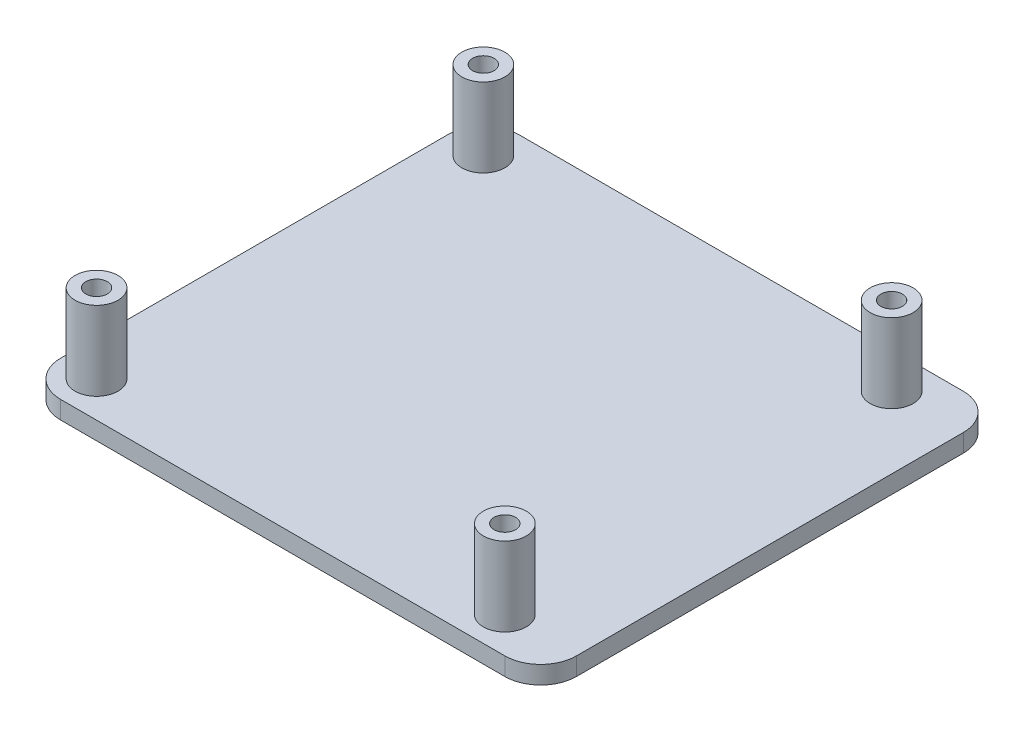
ISO-10303-21;
HEADER;
FILE_DESCRIPTION(('STEP AP214'),'2;1');
FILE_NAME('part.step','',(''),(''),'','','');
FILE_SCHEMA(('AUTOMOTIVE_DESIGN { 1 0 10303 214 1 1 1 1 }'));
ENDSEC;
DATA;
#1=APPLICATION_CONTEXT('core data for automotive mechanical design processes');
#2=APPLICATION_PROTOCOL_DEFINITION('international standard','automotive_design',2000,#1);
#3=PRODUCT_CONTEXT('',#1,'mechanical');
#4=PRODUCT('Part','Part','',(#3));
#5=PRODUCT_RELATED_PRODUCT_CATEGORY('part','',(#4));
#6=PRODUCT_DEFINITION_FORMATION('','',#4);
#7=PRODUCT_DEFINITION_CONTEXT('part definition',#1,'design');
#8=PRODUCT_DEFINITION('design','',#6,#7);
#9=PRODUCT_DEFINITION_SHAPE('','',#8);
#10=(LENGTH_UNIT() NAMED_UNIT(*) SI_UNIT(.MILLI.,.METRE.));
#11=(NAMED_UNIT(*) PLANE_ANGLE_UNIT() SI_UNIT($,.RADIAN.));
#12=(NAMED_UNIT(*) SI_UNIT($,.STERADIAN.) SOLID_ANGLE_UNIT());
#13=UNCERTAINTY_MEASURE_WITH_UNIT(LENGTH_MEASURE(1.E-05),#10,'distance_accuracy_value','');
#14=(GEOMETRIC_REPRESENTATION_CONTEXT(3) GLOBAL_UNCERTAINTY_ASSIGNED_CONTEXT((#13)) GLOBAL_UNIT_ASSIGNED_CONTEXT((#10,
#11,#12)) REPRESENTATION_CONTEXT('',''));
#15=CARTESIAN_POINT('',(0.,0.,0.));
#16=DIRECTION('',(0.,0.,1.));
#17=DIRECTION('',(1.,0.,0.));
#18=AXIS2_PLACEMENT_3D('',#15,#16,#17);
#19=CARTESIAN_POINT('',(-36.,2.5,-32.));
#20=DIRECTION('',(1.,0.,0.));
#21=DIRECTION('',(0.,0.,-1.));
#22=AXIS2_PLACEMENT_3D('',#19,#20,#21);
#23=PLANE('',#22);
#24=DIRECTION('',(0.,0.,1.));
#25=VECTOR('',#24,1.);
#26=CARTESIAN_POINT('',(-36.,0.,-32.));
#27=LINE('',#26,#25);
#28=CARTESIAN_POINT('',(-36.,0.,-27.));
#29=VERTEX_POINT('',#28);
#30=CARTESIAN_POINT('',(-36.,0.,27.));
#31=VERTEX_POINT('',#30);
#32=EDGE_CURVE('E136',#29,#31,#27,.T.);
#33=ORIENTED_EDGE('',*,*,#32,.T.);
#34=DIRECTION('',(0.,-1.,0.));
#35=VECTOR('',#34,1.);
#36=CARTESIAN_POINT('',(-36.,2.5,27.));
#37=LINE('',#36,#35);
#38=CARTESIAN_POINT('',(-36.,2.5,27.));
#39=VERTEX_POINT('',#38);
#40=EDGE_CURVE('E111',#31,#39,#37,.F.);
#41=ORIENTED_EDGE('',*,*,#40,.T.);
#42=DIRECTION('',(0.,0.,1.));
#43=VECTOR('',#42,1.);
#44=CARTESIAN_POINT('',(-36.,2.5,-32.));
#45=LINE('',#44,#43);
#46=CARTESIAN_POINT('',(-36.,2.5,-27.));
#47=VERTEX_POINT('',#46);
#48=EDGE_CURVE('E149',#47,#39,#45,.T.);
#49=ORIENTED_EDGE('',*,*,#48,.F.);
#50=DIRECTION('',(0.,-1.,0.));
#51=VECTOR('',#50,1.);
#52=CARTESIAN_POINT('',(-36.,2.5,-27.));
#53=LINE('',#52,#51);
#54=EDGE_CURVE('E117',#47,#29,#53,.T.);
#55=ORIENTED_EDGE('',*,*,#54,.T.);
#56=EDGE_LOOP('',(#33,#41,#49,#55));
#57=FACE_BOUND('',#56,.T.);
#58=ADVANCED_FACE('F39',(#57),#23,.F.);
#59=CARTESIAN_POINT('',(-36.,2.5,32.));
#60=DIRECTION('',(0.,0.,-1.));
#61=DIRECTION('',(-1.,0.,0.));
#62=AXIS2_PLACEMENT_3D('',#59,#60,#61);
#63=PLANE('',#62);
#64=DIRECTION('',(1.,0.,0.));
#65=VECTOR('',#64,1.);
#66=CARTESIAN_POINT('',(-36.,2.5,32.));
#67=LINE('',#66,#65);
#68=CARTESIAN_POINT('',(-31.,2.5,32.));
#69=VERTEX_POINT('',#68);
#70=CARTESIAN_POINT('',(31.,2.5,32.));
#71=VERTEX_POINT('',#70);
#72=EDGE_CURVE('E127',#69,#71,#67,.T.);
#73=ORIENTED_EDGE('',*,*,#72,.F.);
#74=DIRECTION('',(0.,-1.,0.));
#75=VECTOR('',#74,1.);
#76=CARTESIAN_POINT('',(-31.,2.5,32.));
#77=LINE('',#76,#75);
#78=CARTESIAN_POINT('',(-31.,0.,32.));
#79=VERTEX_POINT('',#78);
#80=EDGE_CURVE('E110',#69,#79,#77,.T.);
#81=ORIENTED_EDGE('',*,*,#80,.T.);
#82=DIRECTION('',(1.,0.,0.));
#83=VECTOR('',#82,1.);
#84=CARTESIAN_POINT('',(-36.,0.,32.));
#85=LINE('',#84,#83);
#86=CARTESIAN_POINT('',(31.,0.,32.));
#87=VERTEX_POINT('',#86);
#88=EDGE_CURVE('E124',#79,#87,#85,.T.);
#89=ORIENTED_EDGE('',*,*,#88,.T.);
#90=DIRECTION('',(0.,-1.,0.));
#91=VECTOR('',#90,1.);
#92=CARTESIAN_POINT('',(31.,2.5,32.));
#93=LINE('',#92,#91);
#94=EDGE_CURVE('E130',#87,#71,#93,.F.);
#95=ORIENTED_EDGE('',*,*,#94,.T.);
#96=EDGE_LOOP('',(#73,#81,#89,#95));
#97=FACE_BOUND('',#96,.T.);
#98=ADVANCED_FACE('F123',(#97),#63,.F.);
#99=CARTESIAN_POINT('',(36.,2.5,-32.));
#100=DIRECTION('',(-1.,0.,0.));
#101=DIRECTION('',(0.,0.,1.));
#102=AXIS2_PLACEMENT_3D('',#99,#100,#101);
#103=PLANE('',#102);
#104=DIRECTION('',(0.,0.,-1.));
#105=VECTOR('',#104,1.);
#106=CARTESIAN_POINT('',(36.,2.5,-32.));
#107=LINE('',#106,#105);
#108=CARTESIAN_POINT('',(36.,2.5,27.));
#109=VERTEX_POINT('',#108);
#110=CARTESIAN_POINT('',(36.,2.5,-27.));
#111=VERTEX_POINT('',#110);
#112=EDGE_CURVE('E203',#109,#111,#107,.T.);
#113=ORIENTED_EDGE('',*,*,#112,.F.);
#114=DIRECTION('',(0.,-1.,0.));
#115=VECTOR('',#114,1.);
#116=CARTESIAN_POINT('',(36.,2.5,27.));
#117=LINE('',#116,#115);
#118=CARTESIAN_POINT('',(36.,0.,27.));
#119=VERTEX_POINT('',#118);
#120=EDGE_CURVE('E197',#109,#119,#117,.T.);
#121=ORIENTED_EDGE('',*,*,#120,.T.);
#122=DIRECTION('',(0.,0.,-1.));
#123=VECTOR('',#122,1.);
#124=CARTESIAN_POINT('',(36.,0.,-32.));
#125=LINE('',#124,#123);
#126=CARTESIAN_POINT('',(36.,0.,-27.));
#127=VERTEX_POINT('',#126);
#128=EDGE_CURVE('E135',#119,#127,#125,.T.);
#129=ORIENTED_EDGE('',*,*,#128,.T.);
#130=DIRECTION('',(0.,-1.,0.));
#131=VECTOR('',#130,1.);
#132=CARTESIAN_POINT('',(36.,2.5,-27.));
#133=LINE('',#132,#131);
#134=EDGE_CURVE('E194',#127,#111,#133,.F.);
#135=ORIENTED_EDGE('',*,*,#134,.T.);
#136=EDGE_LOOP('',(#113,#121,#129,#135));
#137=FACE_BOUND('',#136,.T.);
#138=ADVANCED_FACE('F282',(#137),#103,.F.);
#139=CARTESIAN_POINT('',(-36.,2.5,-32.));
#140=DIRECTION('',(0.,0.,1.));
#141=DIRECTION('',(1.,0.,0.));
#142=AXIS2_PLACEMENT_3D('',#139,#140,#141);
#143=PLANE('',#142);
#144=DIRECTION('',(-1.,0.,0.));
#145=VECTOR('',#144,1.);
#146=CARTESIAN_POINT('',(-36.,2.5,-32.));
#147=LINE('',#146,#145);
#148=CARTESIAN_POINT('',(31.,2.5,-32.));
#149=VERTEX_POINT('',#148);
#150=CARTESIAN_POINT('',(-31.,2.5,-32.));
#151=VERTEX_POINT('',#150);
#152=EDGE_CURVE('E169',#149,#151,#147,.T.);
#153=ORIENTED_EDGE('',*,*,#152,.F.);
#154=DIRECTION('',(0.,-1.,0.));
#155=VECTOR('',#154,1.);
#156=CARTESIAN_POINT('',(31.,2.5,-32.));
#157=LINE('',#156,#155);
#158=CARTESIAN_POINT('',(31.,0.,-32.));
#159=VERTEX_POINT('',#158);
#160=EDGE_CURVE('E11',#149,#159,#157,.T.);
#161=ORIENTED_EDGE('',*,*,#160,.T.);
#162=DIRECTION('',(-1.,0.,0.));
#163=VECTOR('',#162,1.);
#164=CARTESIAN_POINT('',(-36.,0.,-32.));
#165=LINE('',#164,#163);
#166=CARTESIAN_POINT('',(-31.,0.,-32.));
#167=VERTEX_POINT('',#166);
#168=EDGE_CURVE('E141',#159,#167,#165,.T.);
#169=ORIENTED_EDGE('',*,*,#168,.T.);
#170=DIRECTION('',(0.,-1.,0.));
#171=VECTOR('',#170,1.);
#172=CARTESIAN_POINT('',(-31.,2.5,-32.));
#173=LINE('',#172,#171);
#174=EDGE_CURVE('E48',#167,#151,#173,.F.);
#175=ORIENTED_EDGE('',*,*,#174,.T.);
#176=EDGE_LOOP('',(#153,#161,#169,#175));
#177=FACE_BOUND('',#176,.T.);
#178=ADVANCED_FACE('F302',(#177),#143,.F.);
#179=CARTESIAN_POINT('',(0.,2.5,0.));
#180=DIRECTION('',(0.,1.,0.));
#181=DIRECTION('',(0.,0.,1.));
#182=AXIS2_PLACEMENT_3D('',#179,#180,#181);
#183=PLANE('',#182);
#184=CARTESIAN_POINT('',(26.,2.5,27.));
#185=DIRECTION('',(0.,1.,0.));
#186=DIRECTION('',(0.,0.,1.));
#187=AXIS2_PLACEMENT_3D('',#184,#185,#186);
#188=CIRCLE('',#187,3.);
#189=CARTESIAN_POINT('',(26.,2.5,30.));
#190=VERTEX_POINT('',#189);
#191=EDGE_CURVE('E167',#190,#190,#188,.T.);
#192=ORIENTED_EDGE('',*,*,#191,.F.);
#193=EDGE_LOOP('',(#192));
#194=FACE_BOUND('',#193,.T.);
#195=CARTESIAN_POINT('',(-31.,2.5,27.));
#196=DIRECTION('',(0.,1.,0.));
#197=DIRECTION('',(0.,0.,1.));
#198=AXIS2_PLACEMENT_3D('',#195,#196,#197);
#199=CIRCLE('',#198,3.);
#200=CARTESIAN_POINT('',(-31.,2.5,30.));
#201=VERTEX_POINT('',#200);
#202=EDGE_CURVE('E228',#201,#201,#199,.T.);
#203=ORIENTED_EDGE('',*,*,#202,.F.);
#204=EDGE_LOOP('',(#203));
#205=FACE_BOUND('',#204,.T.);
#206=CARTESIAN_POINT('',(26.,2.5,-27.));
#207=DIRECTION('',(0.,1.,0.));
#208=DIRECTION('',(0.,0.,1.));
#209=AXIS2_PLACEMENT_3D('',#206,#207,#208);
#210=CIRCLE('',#209,3.);
#211=CARTESIAN_POINT('',(26.,2.5,-24.));
#212=VERTEX_POINT('',#211);
#213=EDGE_CURVE('E220',#212,#212,#210,.T.);
#214=ORIENTED_EDGE('',*,*,#213,.F.);
#215=EDGE_LOOP('',(#214));
#216=FACE_BOUND('',#215,.T.);
#217=CARTESIAN_POINT('',(-31.,2.5,-27.));
#218=DIRECTION('',(0.,1.,0.));
#219=DIRECTION('',(0.,0.,1.));
#220=AXIS2_PLACEMENT_3D('',#217,#218,#219);
#221=CIRCLE('',#220,3.);
#222=CARTESIAN_POINT('',(-31.,2.5,-24.));
#223=VERTEX_POINT('',#222);
#224=EDGE_CURVE('E212',#223,#223,#221,.T.);
#225=ORIENTED_EDGE('',*,*,#224,.F.);
#226=EDGE_LOOP('',(#225));
#227=FACE_BOUND('',#226,.T.);
#228=ORIENTED_EDGE('',*,*,#48,.T.);
#229=CARTESIAN_POINT('',(-31.,2.5,27.));
#230=DIRECTION('',(0.,1.,0.));
#231=DIRECTION('',(0.,0.,1.));
#232=AXIS2_PLACEMENT_3D('',#229,#230,#231);
#233=CIRCLE('',#232,5.);
#234=EDGE_CURVE('E191',#39,#69,#233,.T.);
#235=ORIENTED_EDGE('',*,*,#234,.T.);
#236=ORIENTED_EDGE('',*,*,#72,.T.);
#237=CARTESIAN_POINT('',(31.,2.5,27.));
#238=DIRECTION('',(0.,1.,0.));
#239=DIRECTION('',(0.,0.,1.));
#240=AXIS2_PLACEMENT_3D('',#237,#238,#239);
#241=CIRCLE('',#240,5.);
#242=EDGE_CURVE('E188',#71,#109,#241,.T.);
#243=ORIENTED_EDGE('',*,*,#242,.T.);
#244=ORIENTED_EDGE('',*,*,#112,.T.);
#245=CARTESIAN_POINT('',(31.,2.5,-27.));
#246=DIRECTION('',(0.,1.,0.));
#247=DIRECTION('',(0.,0.,1.));
#248=AXIS2_PLACEMENT_3D('',#245,#246,#247);
#249=CIRCLE('',#248,5.);
#250=EDGE_CURVE('E61',#111,#149,#249,.T.);
#251=ORIENTED_EDGE('',*,*,#250,.T.);
#252=ORIENTED_EDGE('',*,*,#152,.T.);
#253=CARTESIAN_POINT('',(-31.,2.5,-27.));
#254=DIRECTION('',(0.,1.,0.));
#255=DIRECTION('',(0.,0.,1.));
#256=AXIS2_PLACEMENT_3D('',#253,#254,#255);
#257=CIRCLE('',#256,5.);
#258=EDGE_CURVE('E183',#151,#47,#257,.T.);
#259=ORIENTED_EDGE('',*,*,#258,.T.);
#260=EDGE_LOOP('',(#228,#235,#236,#243,#244,#251,#252,#259));
#261=FACE_BOUND('',#260,.T.);
#262=ADVANCED_FACE('F305',(#194,#205,#216,#227,#261),#183,.T.);
#263=CARTESIAN_POINT('',(0.,0.,0.));
#264=DIRECTION('',(0.,1.,0.));
#265=DIRECTION('',(0.,0.,1.));
#266=AXIS2_PLACEMENT_3D('',#263,#264,#265);
#267=PLANE('',#266);
#268=CARTESIAN_POINT('',(-31.,0.,27.));
#269=DIRECTION('',(0.,1.,0.));
#270=DIRECTION('',(0.,0.,1.));
#271=AXIS2_PLACEMENT_3D('',#268,#269,#270);
#272=CIRCLE('',#271,1.5);
#273=CARTESIAN_POINT('',(-31.,0.,28.5));
#274=VERTEX_POINT('',#273);
#275=EDGE_CURVE('E245',#274,#274,#272,.T.);
#276=ORIENTED_EDGE('',*,*,#275,.T.);
#277=EDGE_LOOP('',(#276));
#278=FACE_BOUND('',#277,.T.);
#279=CARTESIAN_POINT('',(26.,0.,-27.));
#280=DIRECTION('',(0.,1.,0.));
#281=DIRECTION('',(0.,0.,1.));
#282=AXIS2_PLACEMENT_3D('',#279,#280,#281);
#283=CIRCLE('',#282,1.5);
#284=CARTESIAN_POINT('',(26.,0.,-25.5));
#285=VERTEX_POINT('',#284);
#286=EDGE_CURVE('E246',#285,#285,#283,.T.);
#287=ORIENTED_EDGE('',*,*,#286,.T.);
#288=EDGE_LOOP('',(#287));
#289=FACE_BOUND('',#288,.T.);
#290=CARTESIAN_POINT('',(26.,0.,27.));
#291=DIRECTION('',(0.,1.,0.));
#292=DIRECTION('',(0.,0.,1.));
#293=AXIS2_PLACEMENT_3D('',#290,#291,#292);
#294=CIRCLE('',#293,1.5);
#295=CARTESIAN_POINT('',(26.,0.,28.5));
#296=VERTEX_POINT('',#295);
#297=EDGE_CURVE('E250',#296,#296,#294,.T.);
#298=ORIENTED_EDGE('',*,*,#297,.T.);
#299=EDGE_LOOP('',(#298));
#300=FACE_BOUND('',#299,.T.);
#301=CARTESIAN_POINT('',(-31.,0.,-27.));
#302=DIRECTION('',(0.,1.,0.));
#303=DIRECTION('',(0.,0.,1.));
#304=AXIS2_PLACEMENT_3D('',#301,#302,#303);
#305=CIRCLE('',#304,1.5);
#306=CARTESIAN_POINT('',(-31.,0.,-25.5));
#307=VERTEX_POINT('',#306);
#308=EDGE_CURVE('E155',#307,#307,#305,.T.);
#309=ORIENTED_EDGE('',*,*,#308,.T.);
#310=EDGE_LOOP('',(#309));
#311=FACE_BOUND('',#310,.T.);
#312=ORIENTED_EDGE('',*,*,#88,.F.);
#313=CARTESIAN_POINT('',(-31.,0.,27.));
#314=DIRECTION('',(0.,1.,0.));
#315=DIRECTION('',(0.,0.,1.));
#316=AXIS2_PLACEMENT_3D('',#313,#314,#315);
#317=CIRCLE('',#316,5.);
#318=EDGE_CURVE('E106',#79,#31,#317,.F.);
#319=ORIENTED_EDGE('',*,*,#318,.T.);
#320=ORIENTED_EDGE('',*,*,#32,.F.);
#321=CARTESIAN_POINT('',(-31.,0.,-27.));
#322=DIRECTION('',(0.,1.,0.));
#323=DIRECTION('',(0.,0.,1.));
#324=AXIS2_PLACEMENT_3D('',#321,#322,#323);
#325=CIRCLE('',#324,5.);
#326=EDGE_CURVE('E129',#29,#167,#325,.F.);
#327=ORIENTED_EDGE('',*,*,#326,.T.);
#328=ORIENTED_EDGE('',*,*,#168,.F.);
#329=CARTESIAN_POINT('',(31.,0.,-27.));
#330=DIRECTION('',(0.,1.,0.));
#331=DIRECTION('',(0.,0.,1.));
#332=AXIS2_PLACEMENT_3D('',#329,#330,#331);
#333=CIRCLE('',#332,5.);
#334=EDGE_CURVE('E173',#159,#127,#333,.F.);
#335=ORIENTED_EDGE('',*,*,#334,.T.);
#336=ORIENTED_EDGE('',*,*,#128,.F.);
#337=CARTESIAN_POINT('',(31.,0.,27.));
#338=DIRECTION('',(0.,1.,0.));
#339=DIRECTION('',(0.,0.,1.));
#340=AXIS2_PLACEMENT_3D('',#337,#338,#339);
#341=CIRCLE('',#340,5.);
#342=EDGE_CURVE('E118',#119,#87,#341,.F.);
#343=ORIENTED_EDGE('',*,*,#342,.T.);
#344=EDGE_LOOP('',(#312,#319,#320,#327,#328,#335,#336,#343));
#345=FACE_BOUND('',#344,.T.);
#346=ADVANCED_FACE('F132',(#278,#289,#300,#311,#345),#267,.F.);
#347=CARTESIAN_POINT('',(-31.,13.5,-27.));
#348=DIRECTION('',(0.,-1.,0.));
#349=DIRECTION('',(0.,0.,-1.));
#350=AXIS2_PLACEMENT_3D('',#347,#348,#349);
#351=CYLINDRICAL_SURFACE('',#350,3.);
#352=CARTESIAN_POINT('',(-31.,13.5,-27.));
#353=DIRECTION('',(0.,1.,0.));
#354=DIRECTION('',(0.,0.,1.));
#355=AXIS2_PLACEMENT_3D('',#352,#353,#354);
#356=CIRCLE('',#355,3.);
#357=CARTESIAN_POINT('',(-31.,13.5,-24.));
#358=VERTEX_POINT('',#357);
#359=EDGE_CURVE('E143',#358,#358,#356,.T.);
#360=ORIENTED_EDGE('',*,*,#359,.F.);
#361=EDGE_LOOP('',(#360));
#362=FACE_BOUND('',#361,.T.);
#363=ORIENTED_EDGE('',*,*,#224,.T.);
#364=EDGE_LOOP('',(#363));
#365=FACE_BOUND('',#364,.T.);
#366=ADVANCED_FACE('F313',(#362,#365),#351,.T.);
#367=CARTESIAN_POINT('',(-31.,13.5,-27.));
#368=DIRECTION('',(0.,1.,0.));
#369=DIRECTION('',(0.,0.,1.));
#370=AXIS2_PLACEMENT_3D('',#367,#368,#369);
#371=PLANE('',#370);
#372=CARTESIAN_POINT('',(-31.,13.5,-27.));
#373=DIRECTION('',(0.,1.,0.));
#374=DIRECTION('',(0.,0.,1.));
#375=AXIS2_PLACEMENT_3D('',#372,#373,#374);
#376=CIRCLE('',#375,1.5);
#377=CARTESIAN_POINT('',(-31.,13.5,-25.5));
#378=VERTEX_POINT('',#377);
#379=EDGE_CURVE('E163',#378,#378,#376,.T.);
#380=ORIENTED_EDGE('',*,*,#379,.F.);
#381=EDGE_LOOP('',(#380));
#382=FACE_BOUND('',#381,.T.);
#383=ORIENTED_EDGE('',*,*,#359,.T.);
#384=EDGE_LOOP('',(#383));
#385=FACE_BOUND('',#384,.T.);
#386=ADVANCED_FACE('F431',(#382,#385),#371,.T.);
#387=CARTESIAN_POINT('',(26.,13.5,-27.));
#388=DIRECTION('',(0.,-1.,0.));
#389=DIRECTION('',(0.,0.,-1.));
#390=AXIS2_PLACEMENT_3D('',#387,#388,#389);
#391=CYLINDRICAL_SURFACE('',#390,3.);
#392=CARTESIAN_POINT('',(26.,13.5,-27.));
#393=DIRECTION('',(0.,1.,0.));
#394=DIRECTION('',(0.,0.,1.));
#395=AXIS2_PLACEMENT_3D('',#392,#393,#394);
#396=CIRCLE('',#395,3.);
#397=CARTESIAN_POINT('',(26.,13.5,-24.));
#398=VERTEX_POINT('',#397);
#399=EDGE_CURVE('E216',#398,#398,#396,.T.);
#400=ORIENTED_EDGE('',*,*,#399,.F.);
#401=EDGE_LOOP('',(#400));
#402=FACE_BOUND('',#401,.T.);
#403=ORIENTED_EDGE('',*,*,#213,.T.);
#404=EDGE_LOOP('',(#403));
#405=FACE_BOUND('',#404,.T.);
#406=ADVANCED_FACE('F423',(#402,#405),#391,.T.);
#407=CARTESIAN_POINT('',(26.,13.5,-27.));
#408=DIRECTION('',(0.,1.,0.));
#409=DIRECTION('',(0.,0.,1.));
#410=AXIS2_PLACEMENT_3D('',#407,#408,#409);
#411=PLANE('',#410);
#412=CARTESIAN_POINT('',(26.,13.5,-27.));
#413=DIRECTION('',(0.,1.,0.));
#414=DIRECTION('',(0.,0.,1.));
#415=AXIS2_PLACEMENT_3D('',#412,#413,#414);
#416=CIRCLE('',#415,1.5);
#417=CARTESIAN_POINT('',(26.,13.5,-25.5));
#418=VERTEX_POINT('',#417);
#419=EDGE_CURVE('E159',#418,#418,#416,.T.);
#420=ORIENTED_EDGE('',*,*,#419,.F.);
#421=EDGE_LOOP('',(#420));
#422=FACE_BOUND('',#421,.T.);
#423=ORIENTED_EDGE('',*,*,#399,.T.);
#424=EDGE_LOOP('',(#423));
#425=FACE_BOUND('',#424,.T.);
#426=ADVANCED_FACE('F418',(#422,#425),#411,.T.);
#427=CARTESIAN_POINT('',(-31.,13.5,27.));
#428=DIRECTION('',(0.,-1.,0.));
#429=DIRECTION('',(0.,0.,-1.));
#430=AXIS2_PLACEMENT_3D('',#427,#428,#429);
#431=CYLINDRICAL_SURFACE('',#430,3.);
#432=CARTESIAN_POINT('',(-31.,13.5,27.));
#433=DIRECTION('',(0.,1.,0.));
#434=DIRECTION('',(0.,0.,1.));
#435=AXIS2_PLACEMENT_3D('',#432,#433,#434);
#436=CIRCLE('',#435,3.);
#437=CARTESIAN_POINT('',(-31.,13.5,30.));
#438=VERTEX_POINT('',#437);
#439=EDGE_CURVE('E224',#438,#438,#436,.T.);
#440=ORIENTED_EDGE('',*,*,#439,.F.);
#441=EDGE_LOOP('',(#440));
#442=FACE_BOUND('',#441,.T.);
#443=ORIENTED_EDGE('',*,*,#202,.T.);
#444=EDGE_LOOP('',(#443));
#445=FACE_BOUND('',#444,.T.);
#446=ADVANCED_FACE('F410',(#442,#445),#431,.T.);
#447=CARTESIAN_POINT('',(-31.,13.5,27.));
#448=DIRECTION('',(0.,1.,0.));
#449=DIRECTION('',(0.,0.,1.));
#450=AXIS2_PLACEMENT_3D('',#447,#448,#449);
#451=PLANE('',#450);
#452=CARTESIAN_POINT('',(-31.,13.5,27.));
#453=DIRECTION('',(0.,1.,0.));
#454=DIRECTION('',(0.,0.,1.));
#455=AXIS2_PLACEMENT_3D('',#452,#453,#454);
#456=CIRCLE('',#455,1.5);
#457=CARTESIAN_POINT('',(-31.,13.5,28.5));
#458=VERTEX_POINT('',#457);
#459=EDGE_CURVE('E154',#458,#458,#456,.T.);
#460=ORIENTED_EDGE('',*,*,#459,.F.);
#461=EDGE_LOOP('',(#460));
#462=FACE_BOUND('',#461,.T.);
#463=ORIENTED_EDGE('',*,*,#439,.T.);
#464=EDGE_LOOP('',(#463));
#465=FACE_BOUND('',#464,.T.);
#466=ADVANCED_FACE('F405',(#462,#465),#451,.T.);
#467=CARTESIAN_POINT('',(26.,13.5,27.));
#468=DIRECTION('',(0.,-1.,0.));
#469=DIRECTION('',(0.,0.,-1.));
#470=AXIS2_PLACEMENT_3D('',#467,#468,#469);
#471=CYLINDRICAL_SURFACE('',#470,3.);
#472=CARTESIAN_POINT('',(26.,13.5,27.));
#473=DIRECTION('',(0.,1.,0.));
#474=DIRECTION('',(0.,0.,1.));
#475=AXIS2_PLACEMENT_3D('',#472,#473,#474);
#476=CIRCLE('',#475,3.);
#477=CARTESIAN_POINT('',(26.,13.5,30.));
#478=VERTEX_POINT('',#477);
#479=EDGE_CURVE('E232',#478,#478,#476,.T.);
#480=ORIENTED_EDGE('',*,*,#479,.F.);
#481=EDGE_LOOP('',(#480));
#482=FACE_BOUND('',#481,.T.);
#483=ORIENTED_EDGE('',*,*,#191,.T.);
#484=EDGE_LOOP('',(#483));
#485=FACE_BOUND('',#484,.T.);
#486=ADVANCED_FACE('F273',(#482,#485),#471,.T.);
#487=CARTESIAN_POINT('',(26.,13.5,27.));
#488=DIRECTION('',(0.,1.,0.));
#489=DIRECTION('',(0.,0.,1.));
#490=AXIS2_PLACEMENT_3D('',#487,#488,#489);
#491=PLANE('',#490);
#492=CARTESIAN_POINT('',(26.,13.5,27.));
#493=DIRECTION('',(0.,1.,0.));
#494=DIRECTION('',(0.,0.,1.));
#495=AXIS2_PLACEMENT_3D('',#492,#493,#494);
#496=CIRCLE('',#495,1.5);
#497=CARTESIAN_POINT('',(26.,13.5,28.5));
#498=VERTEX_POINT('',#497);
#499=EDGE_CURVE('E150',#498,#498,#496,.T.);
#500=ORIENTED_EDGE('',*,*,#499,.F.);
#501=EDGE_LOOP('',(#500));
#502=FACE_BOUND('',#501,.T.);
#503=ORIENTED_EDGE('',*,*,#479,.T.);
#504=EDGE_LOOP('',(#503));
#505=FACE_BOUND('',#504,.T.);
#506=ADVANCED_FACE('F263',(#502,#505),#491,.T.);
#507=CARTESIAN_POINT('',(26.,0.,27.));
#508=DIRECTION('',(0.,1.,0.));
#509=DIRECTION('',(0.,0.,1.));
#510=AXIS2_PLACEMENT_3D('',#507,#508,#509);
#511=CYLINDRICAL_SURFACE('',#510,1.5);
#512=ORIENTED_EDGE('',*,*,#499,.T.);
#513=EDGE_LOOP('',(#512));
#514=FACE_BOUND('',#513,.T.);
#515=ORIENTED_EDGE('',*,*,#297,.F.);
#516=EDGE_LOOP('',(#515));
#517=FACE_BOUND('',#516,.T.);
#518=ADVANCED_FACE('F260',(#514,#517),#511,.F.);
#519=CARTESIAN_POINT('',(-31.,0.,27.));
#520=DIRECTION('',(0.,1.,0.));
#521=DIRECTION('',(0.,0.,1.));
#522=AXIS2_PLACEMENT_3D('',#519,#520,#521);
#523=CYLINDRICAL_SURFACE('',#522,1.5);
#524=ORIENTED_EDGE('',*,*,#459,.T.);
#525=EDGE_LOOP('',(#524));
#526=FACE_BOUND('',#525,.T.);
#527=ORIENTED_EDGE('',*,*,#275,.F.);
#528=EDGE_LOOP('',(#527));
#529=FACE_BOUND('',#528,.T.);
#530=ADVANCED_FACE('F262',(#526,#529),#523,.F.);
#531=CARTESIAN_POINT('',(26.,0.,-27.));
#532=DIRECTION('',(0.,1.,0.));
#533=DIRECTION('',(0.,0.,1.));
#534=AXIS2_PLACEMENT_3D('',#531,#532,#533);
#535=CYLINDRICAL_SURFACE('',#534,1.5);
#536=ORIENTED_EDGE('',*,*,#419,.T.);
#537=EDGE_LOOP('',(#536));
#538=FACE_BOUND('',#537,.T.);
#539=ORIENTED_EDGE('',*,*,#286,.F.);
#540=EDGE_LOOP('',(#539));
#541=FACE_BOUND('',#540,.T.);
#542=ADVANCED_FACE('F270',(#538,#541),#535,.F.);
#543=CARTESIAN_POINT('',(-31.,0.,-27.));
#544=DIRECTION('',(0.,1.,0.));
#545=DIRECTION('',(0.,0.,1.));
#546=AXIS2_PLACEMENT_3D('',#543,#544,#545);
#547=CYLINDRICAL_SURFACE('',#546,1.5);
#548=ORIENTED_EDGE('',*,*,#379,.T.);
#549=EDGE_LOOP('',(#548));
#550=FACE_BOUND('',#549,.T.);
#551=ORIENTED_EDGE('',*,*,#308,.F.);
#552=EDGE_LOOP('',(#551));
#553=FACE_BOUND('',#552,.T.);
#554=ADVANCED_FACE('F289',(#550,#553),#547,.F.);
#555=CARTESIAN_POINT('',(-31.,2.5,27.));
#556=DIRECTION('',(0.,-1.,0.));
#557=DIRECTION('',(0.,0.,-1.));
#558=AXIS2_PLACEMENT_3D('',#555,#556,#557);
#559=CYLINDRICAL_SURFACE('',#558,5.);
#560=ORIENTED_EDGE('',*,*,#234,.F.);
#561=ORIENTED_EDGE('',*,*,#40,.F.);
#562=ORIENTED_EDGE('',*,*,#318,.F.);
#563=ORIENTED_EDGE('',*,*,#80,.F.);
#564=EDGE_LOOP('',(#560,#561,#562,#563));
#565=FACE_BOUND('',#564,.T.);
#566=ADVANCED_FACE('F109',(#565),#559,.T.);
#567=CARTESIAN_POINT('',(31.,2.5,27.));
#568=DIRECTION('',(0.,-1.,0.));
#569=DIRECTION('',(0.,0.,-1.));
#570=AXIS2_PLACEMENT_3D('',#567,#568,#569);
#571=CYLINDRICAL_SURFACE('',#570,5.);
#572=ORIENTED_EDGE('',*,*,#242,.F.);
#573=ORIENTED_EDGE('',*,*,#94,.F.);
#574=ORIENTED_EDGE('',*,*,#342,.F.);
#575=ORIENTED_EDGE('',*,*,#120,.F.);
#576=EDGE_LOOP('',(#572,#573,#574,#575));
#577=FACE_BOUND('',#576,.T.);
#578=ADVANCED_FACE('F288',(#577),#571,.T.);
#579=CARTESIAN_POINT('',(31.,2.5,-27.));
#580=DIRECTION('',(0.,-1.,0.));
#581=DIRECTION('',(0.,0.,-1.));
#582=AXIS2_PLACEMENT_3D('',#579,#580,#581);
#583=CYLINDRICAL_SURFACE('',#582,5.);
#584=ORIENTED_EDGE('',*,*,#250,.F.);
#585=ORIENTED_EDGE('',*,*,#134,.F.);
#586=ORIENTED_EDGE('',*,*,#334,.F.);
#587=ORIENTED_EDGE('',*,*,#160,.F.);
#588=EDGE_LOOP('',(#584,#585,#586,#587));
#589=FACE_BOUND('',#588,.T.);
#590=ADVANCED_FACE('F291',(#589),#583,.T.);
#591=CARTESIAN_POINT('',(-31.,2.5,-27.));
#592=DIRECTION('',(0.,-1.,0.));
#593=DIRECTION('',(0.,0.,-1.));
#594=AXIS2_PLACEMENT_3D('',#591,#592,#593);
#595=CYLINDRICAL_SURFACE('',#594,5.);
#596=ORIENTED_EDGE('',*,*,#258,.F.);
#597=ORIENTED_EDGE('',*,*,#174,.F.);
#598=ORIENTED_EDGE('',*,*,#326,.F.);
#599=ORIENTED_EDGE('',*,*,#54,.F.);
#600=EDGE_LOOP('',(#596,#597,#598,#599));
#601=FACE_BOUND('',#600,.T.);
#602=ADVANCED_FACE('F41',(#601),#595,.T.);
#603=CLOSED_SHELL('',(#58,#98,#138,#178,#262,#346,#366,#386,#406,#426,#446,#466,#486,#506,#518,
#530,#542,#554,#566,#578,#590,#602));
#604=MANIFOLD_SOLID_BREP('B2',#603);
#605=ADVANCED_BREP_SHAPE_REPRESENTATION('',(#18,#604),#14);
#606=SHAPE_DEFINITION_REPRESENTATION(#9,#605);
ENDSEC;
END-ISO-10303-21;
